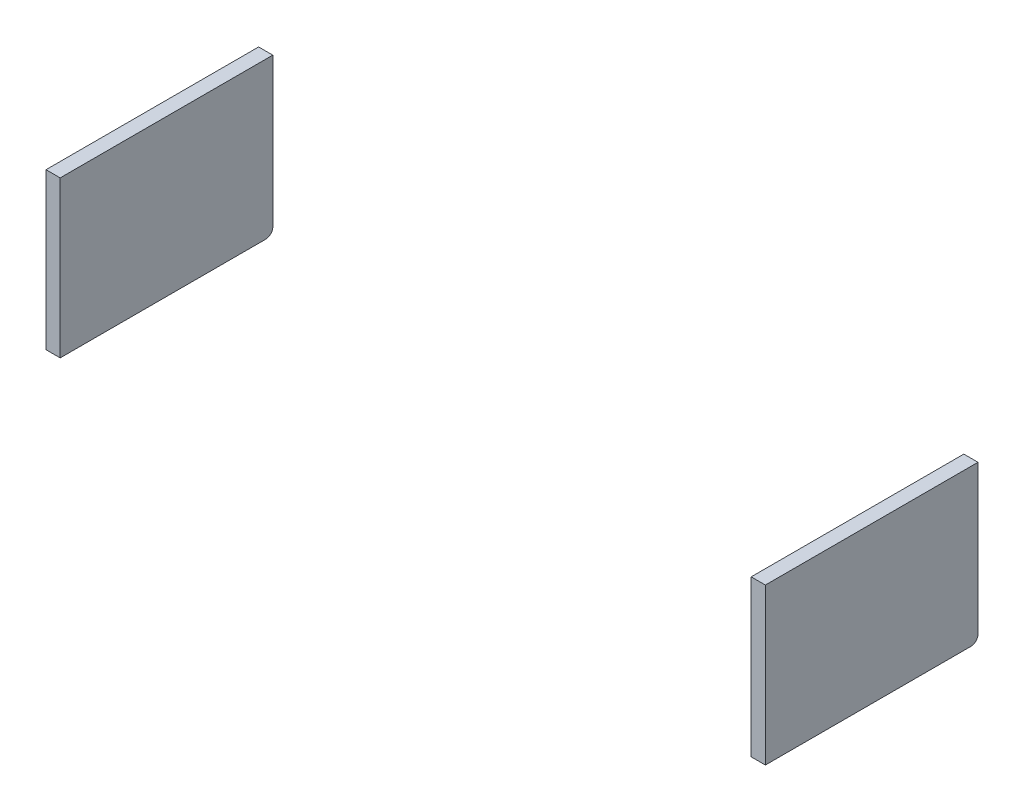
ISO-10303-21;
HEADER;
FILE_DESCRIPTION(('STEP AP214'),'2;1');
FILE_NAME('part.step','',(''),(''),'','','');
FILE_SCHEMA(('AUTOMOTIVE_DESIGN { 1 0 10303 214 1 1 1 1 }'));
ENDSEC;
DATA;
#1=APPLICATION_CONTEXT('core data for automotive mechanical design processes');
#2=APPLICATION_PROTOCOL_DEFINITION('international standard','automotive_design',2000,#1);
#3=PRODUCT_CONTEXT('',#1,'mechanical');
#4=PRODUCT('Part','Part','',(#3));
#5=PRODUCT_RELATED_PRODUCT_CATEGORY('part','',(#4));
#6=PRODUCT_DEFINITION_FORMATION('','',#4);
#7=PRODUCT_DEFINITION_CONTEXT('part definition',#1,'design');
#8=PRODUCT_DEFINITION('design','',#6,#7);
#9=PRODUCT_DEFINITION_SHAPE('','',#8);
#10=(LENGTH_UNIT() NAMED_UNIT(*) SI_UNIT(.MILLI.,.METRE.));
#11=(NAMED_UNIT(*) PLANE_ANGLE_UNIT() SI_UNIT($,.RADIAN.));
#12=(NAMED_UNIT(*) SI_UNIT($,.STERADIAN.) SOLID_ANGLE_UNIT());
#13=UNCERTAINTY_MEASURE_WITH_UNIT(LENGTH_MEASURE(1.E-05),#10,'distance_accuracy_value','');
#14=(GEOMETRIC_REPRESENTATION_CONTEXT(3) GLOBAL_UNCERTAINTY_ASSIGNED_CONTEXT((#13)) GLOBAL_UNIT_ASSIGNED_CONTEXT((#10,
#11,#12)) REPRESENTATION_CONTEXT('',''));
#15=CARTESIAN_POINT('',(0.,0.,0.));
#16=DIRECTION('',(0.,0.,1.));
#17=DIRECTION('',(1.,0.,0.));
#18=AXIS2_PLACEMENT_3D('',#15,#16,#17);
#19=CARTESIAN_POINT('',(-3.92500066,-16.32500066,0.));
#20=DIRECTION('',(-1.,0.,0.));
#21=DIRECTION('',(0.,0.,1.));
#22=AXIS2_PLACEMENT_3D('',#19,#20,#21);
#23=PLANE('',#22);
#24=DIRECTION('',(0.,1.,0.));
#25=VECTOR('',#24,1.);
#26=CARTESIAN_POINT('',(-3.92500066,-18.52500066,0.));
#27=LINE('',#26,#25);
#28=CARTESIAN_POINT('',(-3.92500066,-18.42500066,0.));
#29=VERTEX_POINT('',#28);
#30=CARTESIAN_POINT('',(-3.92500066,-16.32500066,0.));
#31=VERTEX_POINT('',#30);
#32=EDGE_CURVE('P0_E64',#29,#31,#27,.T.);
#33=ORIENTED_EDGE('',*,*,#32,.T.);
#34=DIRECTION('',(0.,0.,-1.));
#35=VECTOR('',#34,1.);
#36=CARTESIAN_POINT('',(-3.92500066,-16.32500066,0.7));
#37=LINE('',#36,#35);
#38=CARTESIAN_POINT('',(-3.92500066,-16.32500066,3.));
#39=VERTEX_POINT('',#38);
#40=EDGE_CURVE('P0_E81',#31,#39,#37,.F.);
#41=ORIENTED_EDGE('',*,*,#40,.T.);
#42=DIRECTION('',(0.,1.,0.));
#43=VECTOR('',#42,1.);
#44=CARTESIAN_POINT('',(-3.92500066,-17.42500066,3.));
#45=LINE('',#44,#43);
#46=CARTESIAN_POINT('',(-3.92500066,-18.52500066,3.));
#47=VERTEX_POINT('',#46);
#48=EDGE_CURVE('P0_E89',#47,#39,#45,.T.);
#49=ORIENTED_EDGE('',*,*,#48,.F.);
#50=DIRECTION('',(0.,0.,-1.));
#51=VECTOR('',#50,1.);
#52=CARTESIAN_POINT('',(-3.92500066,-18.52500066,0.1));
#53=LINE('',#52,#51);
#54=CARTESIAN_POINT('',(-3.92500066,-18.52500066,0.1));
#55=VERTEX_POINT('',#54);
#56=EDGE_CURVE('P0_E66',#55,#47,#53,.F.);
#57=ORIENTED_EDGE('',*,*,#56,.F.);
#58=CARTESIAN_POINT('',(-3.92500066,-18.42500066,0.0999999999999999));
#59=DIRECTION('',(-1.,0.,0.));
#60=DIRECTION('',(0.,0.,1.));
#61=AXIS2_PLACEMENT_3D('',#58,#59,#60);
#62=CIRCLE('',#61,0.1);
#63=EDGE_CURVE('P0_E20',#29,#55,#62,.T.);
#64=ORIENTED_EDGE('',*,*,#63,.F.);
#65=EDGE_LOOP('',(#33,#41,#49,#57,#64));
#66=FACE_BOUND('',#65,.T.);
#67=ADVANCED_FACE('P0_F17',(#66),#23,.F.);
#68=CARTESIAN_POINT('',(-3.77500066,-18.42500066,0.1));
#69=DIRECTION('',(-1.,0.,0.));
#70=DIRECTION('',(0.,0.,1.));
#71=AXIS2_PLACEMENT_3D('',#68,#69,#70);
#72=CYLINDRICAL_SURFACE('',#71,0.1);
#73=ORIENTED_EDGE('',*,*,#63,.T.);
#74=DIRECTION('',(1.,0.,0.));
#75=VECTOR('',#74,1.);
#76=CARTESIAN_POINT('',(-3.62500066,-18.52500066,0.1));
#77=LINE('',#76,#75);
#78=CARTESIAN_POINT('',(-4.12500066,-18.52500066,0.0999999999999999));
#79=VERTEX_POINT('',#78);
#80=EDGE_CURVE('P0_E69',#79,#55,#77,.T.);
#81=ORIENTED_EDGE('',*,*,#80,.F.);
#82=CARTESIAN_POINT('',(-4.12500066,-18.42500066,0.0999999999999998));
#83=DIRECTION('',(-1.,0.,0.));
#84=DIRECTION('',(0.,0.,1.));
#85=AXIS2_PLACEMENT_3D('',#82,#83,#84);
#86=CIRCLE('',#85,0.1);
#87=CARTESIAN_POINT('',(-4.12500066,-18.42500066,0.));
#88=VERTEX_POINT('',#87);
#89=EDGE_CURVE('P0_E74',#88,#79,#86,.T.);
#90=ORIENTED_EDGE('',*,*,#89,.F.);
#91=DIRECTION('',(1.,0.,0.));
#92=VECTOR('',#91,1.);
#93=CARTESIAN_POINT('',(-3.92500066,-18.42500066,0.));
#94=LINE('',#93,#92);
#95=EDGE_CURVE('P0_E71',#88,#29,#94,.T.);
#96=ORIENTED_EDGE('',*,*,#95,.T.);
#97=EDGE_LOOP('',(#73,#81,#90,#96));
#98=FACE_BOUND('',#97,.T.);
#99=ADVANCED_FACE('P0_F72',(#98),#72,.T.);
#100=CARTESIAN_POINT('',(-3.62500066,-18.52500066,0.1));
#101=DIRECTION('',(0.,-1.,0.));
#102=DIRECTION('',(0.,0.,-1.));
#103=AXIS2_PLACEMENT_3D('',#100,#101,#102);
#104=PLANE('',#103);
#105=DIRECTION('',(1.,0.,0.));
#106=VECTOR('',#105,1.);
#107=CARTESIAN_POINT('',(-4.02500066,-18.52500066,3.));
#108=LINE('',#107,#106);
#109=CARTESIAN_POINT('',(-4.12500066,-18.52500066,3.));
#110=VERTEX_POINT('',#109);
#111=EDGE_CURVE('P0_E94',#110,#47,#108,.T.);
#112=ORIENTED_EDGE('',*,*,#111,.F.);
#113=DIRECTION('',(0.,0.,1.));
#114=VECTOR('',#113,1.);
#115=CARTESIAN_POINT('',(-4.12500066,-18.52500066,0.));
#116=LINE('',#115,#114);
#117=EDGE_CURVE('P0_E99',#79,#110,#116,.T.);
#118=ORIENTED_EDGE('',*,*,#117,.F.);
#119=ORIENTED_EDGE('',*,*,#80,.T.);
#120=ORIENTED_EDGE('',*,*,#56,.T.);
#121=EDGE_LOOP('',(#112,#118,#119,#120));
#122=FACE_BOUND('',#121,.T.);
#123=ADVANCED_FACE('P0_F129',(#122),#104,.T.);
#124=CARTESIAN_POINT('',(-4.02500066,-17.42500066,3.));
#125=DIRECTION('',(0.,0.,1.));
#126=DIRECTION('',(1.,0.,0.));
#127=AXIS2_PLACEMENT_3D('',#124,#125,#126);
#128=PLANE('',#127);
#129=DIRECTION('',(1.,0.,0.));
#130=VECTOR('',#129,1.);
#131=CARTESIAN_POINT('',(-3.92500066,-16.32500066,3.));
#132=LINE('',#131,#130);
#133=CARTESIAN_POINT('',(-4.12500066,-16.32500066,3.));
#134=VERTEX_POINT('',#133);
#135=EDGE_CURVE('P0_E78',#39,#134,#132,.F.);
#136=ORIENTED_EDGE('',*,*,#135,.T.);
#137=DIRECTION('',(0.,1.,0.));
#138=VECTOR('',#137,1.);
#139=CARTESIAN_POINT('',(-4.12500066,-16.32500066,3.));
#140=LINE('',#139,#138);
#141=EDGE_CURVE('P0_E102',#110,#134,#140,.T.);
#142=ORIENTED_EDGE('',*,*,#141,.F.);
#143=ORIENTED_EDGE('',*,*,#111,.T.);
#144=ORIENTED_EDGE('',*,*,#48,.T.);
#145=EDGE_LOOP('',(#136,#142,#143,#144));
#146=FACE_BOUND('',#145,.T.);
#147=ADVANCED_FACE('P0_F126',(#146),#128,.T.);
#148=CARTESIAN_POINT('',(-3.92500066,-16.32500066,0.7));
#149=DIRECTION('',(0.,-1.,0.));
#150=DIRECTION('',(0.,0.,-1.));
#151=AXIS2_PLACEMENT_3D('',#148,#149,#150);
#152=PLANE('',#151);
#153=ORIENTED_EDGE('',*,*,#135,.F.);
#154=ORIENTED_EDGE('',*,*,#40,.F.);
#155=DIRECTION('',(1.,0.,0.));
#156=VECTOR('',#155,1.);
#157=CARTESIAN_POINT('',(-3.92500066,-16.32500066,0.));
#158=LINE('',#157,#156);
#159=CARTESIAN_POINT('',(-4.12500066,-16.32500066,0.));
#160=VERTEX_POINT('',#159);
#161=EDGE_CURVE('P0_E35',#31,#160,#158,.F.);
#162=ORIENTED_EDGE('',*,*,#161,.T.);
#163=DIRECTION('',(0.,0.,1.));
#164=VECTOR('',#163,1.);
#165=CARTESIAN_POINT('',(-4.12500066,-16.32500066,0.));
#166=LINE('',#165,#164);
#167=EDGE_CURVE('P0_E26',#134,#160,#166,.F.);
#168=ORIENTED_EDGE('',*,*,#167,.F.);
#169=EDGE_LOOP('',(#153,#154,#162,#168));
#170=FACE_BOUND('',#169,.T.);
#171=ADVANCED_FACE('P0_F130',(#170),#152,.F.);
#172=CARTESIAN_POINT('',(-3.92500066,-18.52500066,0.));
#173=DIRECTION('',(0.,0.,1.));
#174=DIRECTION('',(1.,0.,0.));
#175=AXIS2_PLACEMENT_3D('',#172,#173,#174);
#176=PLANE('',#175);
#177=DIRECTION('',(0.,1.,0.));
#178=VECTOR('',#177,1.);
#179=CARTESIAN_POINT('',(-4.12500066,-16.32500066,0.));
#180=LINE('',#179,#178);
#181=EDGE_CURVE('P0_E11',#160,#88,#180,.F.);
#182=ORIENTED_EDGE('',*,*,#181,.F.);
#183=ORIENTED_EDGE('',*,*,#161,.F.);
#184=ORIENTED_EDGE('',*,*,#32,.F.);
#185=ORIENTED_EDGE('',*,*,#95,.F.);
#186=EDGE_LOOP('',(#182,#183,#184,#185));
#187=FACE_BOUND('',#186,.T.);
#188=ADVANCED_FACE('P0_F77',(#187),#176,.F.);
#189=CARTESIAN_POINT('',(-4.12500066,-16.32500066,0.));
#190=DIRECTION('',(-1.,0.,0.));
#191=DIRECTION('',(0.,0.,1.));
#192=AXIS2_PLACEMENT_3D('',#189,#190,#191);
#193=PLANE('',#192);
#194=ORIENTED_EDGE('',*,*,#167,.T.);
#195=ORIENTED_EDGE('',*,*,#181,.T.);
#196=ORIENTED_EDGE('',*,*,#89,.T.);
#197=ORIENTED_EDGE('',*,*,#117,.T.);
#198=ORIENTED_EDGE('',*,*,#141,.T.);
#199=EDGE_LOOP('',(#194,#195,#196,#197,#198));
#200=FACE_BOUND('',#199,.T.);
#201=ADVANCED_FACE('P0_F131',(#200),#193,.T.);
#202=CLOSED_SHELL('',(#67,#99,#123,#147,#171,#188,#201));
#203=MANIFOLD_SOLID_BREP('P0_B1',#202);
#204=CARTESIAN_POINT('',(-14.07500066,-16.32500066,0.));
#205=DIRECTION('',(1.,0.,0.));
#206=DIRECTION('',(0.,0.,-1.));
#207=AXIS2_PLACEMENT_3D('',#204,#205,#206);
#208=PLANE('',#207);
#209=DIRECTION('',(0.,0.,-1.));
#210=VECTOR('',#209,1.);
#211=CARTESIAN_POINT('',(-14.07500066,-18.52500066,0.1));
#212=LINE('',#211,#210);
#213=CARTESIAN_POINT('',(-14.07500066,-18.52500066,3.));
#214=VERTEX_POINT('',#213);
#215=CARTESIAN_POINT('',(-14.07500066,-18.52500066,0.0999999999999986));
#216=VERTEX_POINT('',#215);
#217=EDGE_CURVE('P1_E65',#214,#216,#212,.T.);
#218=ORIENTED_EDGE('',*,*,#217,.F.);
#219=DIRECTION('',(0.,1.,0.));
#220=VECTOR('',#219,1.);
#221=CARTESIAN_POINT('',(-14.07500066,-17.42500066,3.));
#222=LINE('',#221,#220);
#223=CARTESIAN_POINT('',(-14.07500066,-16.32500066,3.));
#224=VERTEX_POINT('',#223);
#225=EDGE_CURVE('P1_E77',#224,#214,#222,.F.);
#226=ORIENTED_EDGE('',*,*,#225,.F.);
#227=DIRECTION('',(0.,0.,1.));
#228=VECTOR('',#227,1.);
#229=CARTESIAN_POINT('',(-14.07500066,-16.32500066,0.7));
#230=LINE('',#229,#228);
#231=CARTESIAN_POINT('',(-14.07500066,-16.32500066,0.));
#232=VERTEX_POINT('',#231);
#233=EDGE_CURVE('P1_E92',#232,#224,#230,.T.);
#234=ORIENTED_EDGE('',*,*,#233,.F.);
#235=DIRECTION('',(0.,1.,0.));
#236=VECTOR('',#235,1.);
#237=CARTESIAN_POINT('',(-14.07500066,-18.52500066,0.));
#238=LINE('',#237,#236);
#239=CARTESIAN_POINT('',(-14.07500066,-18.42500066,0.));
#240=VERTEX_POINT('',#239);
#241=EDGE_CURVE('P1_E67',#240,#232,#238,.T.);
#242=ORIENTED_EDGE('',*,*,#241,.F.);
#243=CARTESIAN_POINT('',(-14.07500066,-18.42500066,0.0999999999999972));
#244=DIRECTION('',(1.,0.,0.));
#245=DIRECTION('',(0.,0.,-1.));
#246=AXIS2_PLACEMENT_3D('',#243,#244,#245);
#247=CIRCLE('',#246,0.1);
#248=EDGE_CURVE('P1_E20',#216,#240,#247,.T.);
#249=ORIENTED_EDGE('',*,*,#248,.F.);
#250=EDGE_LOOP('',(#218,#226,#234,#242,#249));
#251=FACE_BOUND('',#250,.T.);
#252=ADVANCED_FACE('P1_F17',(#251),#208,.F.);
#253=CARTESIAN_POINT('',(-8.85000066,-18.42500066,0.1));
#254=DIRECTION('',(1.,0.,0.));
#255=DIRECTION('',(0.,0.,-1.));
#256=AXIS2_PLACEMENT_3D('',#253,#254,#255);
#257=CYLINDRICAL_SURFACE('',#256,0.1);
#258=ORIENTED_EDGE('',*,*,#248,.T.);
#259=DIRECTION('',(-1.,0.,0.));
#260=VECTOR('',#259,1.);
#261=CARTESIAN_POINT('',(-14.07500066,-18.42500066,0.));
#262=LINE('',#261,#260);
#263=CARTESIAN_POINT('',(-13.87500066,-18.42500066,0.));
#264=VERTEX_POINT('',#263);
#265=EDGE_CURVE('P1_E70',#264,#240,#262,.T.);
#266=ORIENTED_EDGE('',*,*,#265,.F.);
#267=CARTESIAN_POINT('',(-13.87500066,-18.42500066,0.0999999999999973));
#268=DIRECTION('',(1.,0.,0.));
#269=DIRECTION('',(0.,0.,-1.));
#270=AXIS2_PLACEMENT_3D('',#267,#268,#269);
#271=CIRCLE('',#270,0.1);
#272=CARTESIAN_POINT('',(-13.87500066,-18.52500066,0.0999999999999986));
#273=VERTEX_POINT('',#272);
#274=EDGE_CURVE('P1_E75',#273,#264,#271,.T.);
#275=ORIENTED_EDGE('',*,*,#274,.F.);
#276=DIRECTION('',(1.,0.,0.));
#277=VECTOR('',#276,1.);
#278=CARTESIAN_POINT('',(-3.62500066,-18.52500066,0.1));
#279=LINE('',#278,#277);
#280=EDGE_CURVE('P1_E72',#216,#273,#279,.T.);
#281=ORIENTED_EDGE('',*,*,#280,.F.);
#282=EDGE_LOOP('',(#258,#266,#275,#281));
#283=FACE_BOUND('',#282,.T.);
#284=ADVANCED_FACE('P1_F73',(#283),#257,.T.);
#285=CARTESIAN_POINT('',(-14.07500066,-18.52500066,0.));
#286=DIRECTION('',(0.,0.,-1.));
#287=DIRECTION('',(-1.,0.,0.));
#288=AXIS2_PLACEMENT_3D('',#285,#286,#287);
#289=PLANE('',#288);
#290=DIRECTION('',(1.,0.,0.));
#291=VECTOR('',#290,1.);
#292=CARTESIAN_POINT('',(-14.07500066,-16.32500066,0.));
#293=LINE('',#292,#291);
#294=CARTESIAN_POINT('',(-13.87500066,-16.32500066,0.));
#295=VERTEX_POINT('',#294);
#296=EDGE_CURVE('P1_E94',#295,#232,#293,.F.);
#297=ORIENTED_EDGE('',*,*,#296,.F.);
#298=DIRECTION('',(0.,1.,0.));
#299=VECTOR('',#298,1.);
#300=CARTESIAN_POINT('',(-13.87500066,-16.32500066,0.));
#301=LINE('',#300,#299);
#302=EDGE_CURVE('P1_E81',#264,#295,#301,.T.);
#303=ORIENTED_EDGE('',*,*,#302,.F.);
#304=ORIENTED_EDGE('',*,*,#265,.T.);
#305=ORIENTED_EDGE('',*,*,#241,.T.);
#306=EDGE_LOOP('',(#297,#303,#304,#305));
#307=FACE_BOUND('',#306,.T.);
#308=ADVANCED_FACE('P1_F103',(#307),#289,.T.);
#309=CARTESIAN_POINT('',(-14.07500066,-16.32500066,0.7));
#310=DIRECTION('',(0.,1.,0.));
#311=DIRECTION('',(0.,0.,1.));
#312=AXIS2_PLACEMENT_3D('',#309,#310,#311);
#313=PLANE('',#312);
#314=ORIENTED_EDGE('',*,*,#233,.T.);
#315=DIRECTION('',(1.,0.,0.));
#316=VECTOR('',#315,1.);
#317=CARTESIAN_POINT('',(-13.97500066,-16.32500066,3.));
#318=LINE('',#317,#316);
#319=CARTESIAN_POINT('',(-13.87500066,-16.32500066,3.));
#320=VERTEX_POINT('',#319);
#321=EDGE_CURVE('P1_E89',#320,#224,#318,.F.);
#322=ORIENTED_EDGE('',*,*,#321,.F.);
#323=DIRECTION('',(0.,0.,-1.));
#324=VECTOR('',#323,1.);
#325=CARTESIAN_POINT('',(-13.87500066,-16.32500066,0.));
#326=LINE('',#325,#324);
#327=EDGE_CURVE('P1_E108',#295,#320,#326,.F.);
#328=ORIENTED_EDGE('',*,*,#327,.F.);
#329=ORIENTED_EDGE('',*,*,#296,.T.);
#330=EDGE_LOOP('',(#314,#322,#328,#329));
#331=FACE_BOUND('',#330,.T.);
#332=ADVANCED_FACE('P1_F127',(#331),#313,.T.);
#333=CARTESIAN_POINT('',(-13.97500066,-17.42500066,3.));
#334=DIRECTION('',(0.,0.,1.));
#335=DIRECTION('',(1.,0.,0.));
#336=AXIS2_PLACEMENT_3D('',#333,#334,#335);
#337=PLANE('',#336);
#338=ORIENTED_EDGE('',*,*,#321,.T.);
#339=ORIENTED_EDGE('',*,*,#225,.T.);
#340=DIRECTION('',(1.,0.,0.));
#341=VECTOR('',#340,1.);
#342=CARTESIAN_POINT('',(-3.62500066,-18.52500066,3.));
#343=LINE('',#342,#341);
#344=CARTESIAN_POINT('',(-13.87500066,-18.52500066,3.));
#345=VERTEX_POINT('',#344);
#346=EDGE_CURVE('P1_E35',#345,#214,#343,.F.);
#347=ORIENTED_EDGE('',*,*,#346,.F.);
#348=DIRECTION('',(0.,1.,0.));
#349=VECTOR('',#348,1.);
#350=CARTESIAN_POINT('',(-13.87500066,-16.32500066,3.));
#351=LINE('',#350,#349);
#352=EDGE_CURVE('P1_E26',#320,#345,#351,.F.);
#353=ORIENTED_EDGE('',*,*,#352,.F.);
#354=EDGE_LOOP('',(#338,#339,#347,#353));
#355=FACE_BOUND('',#354,.T.);
#356=ADVANCED_FACE('P1_F125',(#355),#337,.T.);
#357=CARTESIAN_POINT('',(-3.62500066,-18.52500066,0.1));
#358=DIRECTION('',(0.,-1.,0.));
#359=DIRECTION('',(0.,0.,-1.));
#360=AXIS2_PLACEMENT_3D('',#357,#358,#359);
#361=PLANE('',#360);
#362=ORIENTED_EDGE('',*,*,#346,.T.);
#363=ORIENTED_EDGE('',*,*,#217,.T.);
#364=ORIENTED_EDGE('',*,*,#280,.T.);
#365=DIRECTION('',(0.,0.,-1.));
#366=VECTOR('',#365,1.);
#367=CARTESIAN_POINT('',(-13.87500066,-18.52500066,0.));
#368=LINE('',#367,#366);
#369=EDGE_CURVE('P1_E11',#345,#273,#368,.T.);
#370=ORIENTED_EDGE('',*,*,#369,.F.);
#371=EDGE_LOOP('',(#362,#363,#364,#370));
#372=FACE_BOUND('',#371,.T.);
#373=ADVANCED_FACE('P1_F79',(#372),#361,.T.);
#374=CARTESIAN_POINT('',(-13.87500066,-16.32500066,0.));
#375=DIRECTION('',(1.,0.,0.));
#376=DIRECTION('',(0.,0.,-1.));
#377=AXIS2_PLACEMENT_3D('',#374,#375,#376);
#378=PLANE('',#377);
#379=ORIENTED_EDGE('',*,*,#352,.T.);
#380=ORIENTED_EDGE('',*,*,#369,.T.);
#381=ORIENTED_EDGE('',*,*,#274,.T.);
#382=ORIENTED_EDGE('',*,*,#302,.T.);
#383=ORIENTED_EDGE('',*,*,#327,.T.);
#384=EDGE_LOOP('',(#379,#380,#381,#382,#383));
#385=FACE_BOUND('',#384,.T.);
#386=ADVANCED_FACE('P1_F111',(#385),#378,.T.);
#387=CLOSED_SHELL('',(#252,#284,#308,#332,#356,#373,#386));
#388=MANIFOLD_SOLID_BREP('P1_B1',#387);
#389=ADVANCED_BREP_SHAPE_REPRESENTATION('',(#18,#203,#388),#14);
#390=SHAPE_DEFINITION_REPRESENTATION(#9,#389);
ENDSEC;
END-ISO-10303-21;
